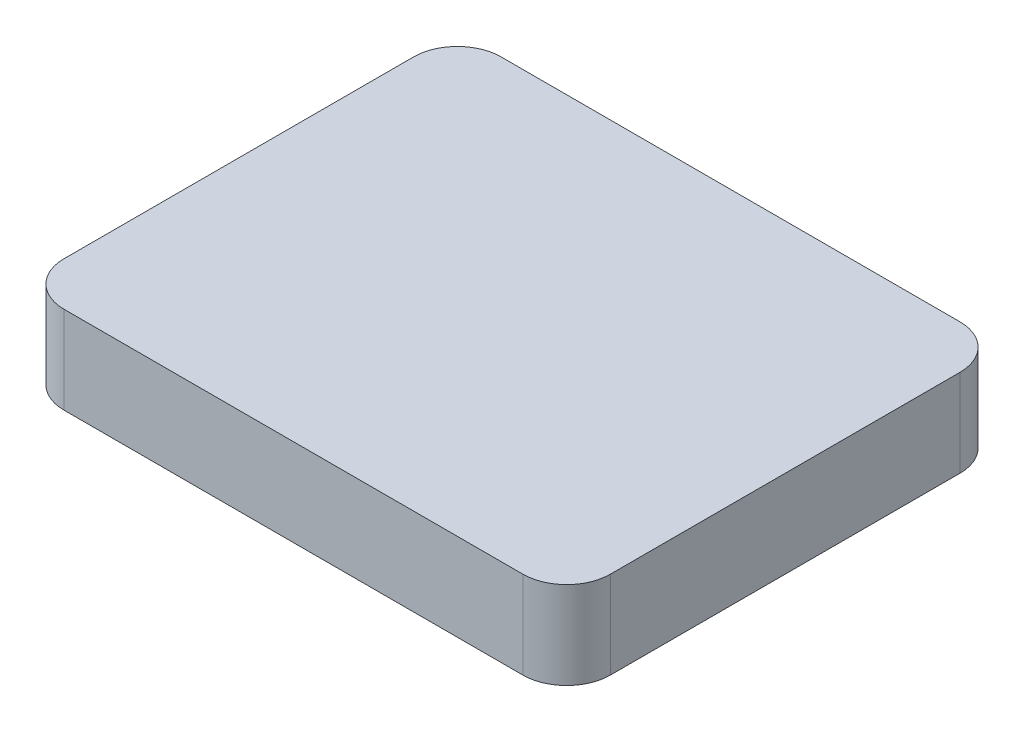
ISO-10303-21;
HEADER;
FILE_DESCRIPTION(('STEP AP214'),'2;1');
FILE_NAME('part.step','',(''),(''),'','','');
FILE_SCHEMA(('AUTOMOTIVE_DESIGN { 1 0 10303 214 1 1 1 1 }'));
ENDSEC;
DATA;
#1=APPLICATION_CONTEXT('core data for automotive mechanical design processes');
#2=APPLICATION_PROTOCOL_DEFINITION('international standard','automotive_design',2000,#1);
#3=PRODUCT_CONTEXT('',#1,'mechanical');
#4=PRODUCT('Part','Part','',(#3));
#5=PRODUCT_RELATED_PRODUCT_CATEGORY('part','',(#4));
#6=PRODUCT_DEFINITION_FORMATION('','',#4);
#7=PRODUCT_DEFINITION_CONTEXT('part definition',#1,'design');
#8=PRODUCT_DEFINITION('design','',#6,#7);
#9=PRODUCT_DEFINITION_SHAPE('','',#8);
#10=(LENGTH_UNIT() NAMED_UNIT(*) SI_UNIT(.MILLI.,.METRE.));
#11=(NAMED_UNIT(*) PLANE_ANGLE_UNIT() SI_UNIT($,.RADIAN.));
#12=(NAMED_UNIT(*) SI_UNIT($,.STERADIAN.) SOLID_ANGLE_UNIT());
#13=UNCERTAINTY_MEASURE_WITH_UNIT(LENGTH_MEASURE(1.E-05),#10,'distance_accuracy_value','');
#14=(GEOMETRIC_REPRESENTATION_CONTEXT(3) GLOBAL_UNCERTAINTY_ASSIGNED_CONTEXT((#13)) GLOBAL_UNIT_ASSIGNED_CONTEXT((#10,
#11,#12)) REPRESENTATION_CONTEXT('',''));
#15=CARTESIAN_POINT('',(0.,0.,0.));
#16=DIRECTION('',(0.,0.,1.));
#17=DIRECTION('',(1.,0.,0.));
#18=AXIS2_PLACEMENT_3D('',#15,#16,#17);
#19=CARTESIAN_POINT('',(-105.,40.,-80.));
#20=DIRECTION('',(0.,-1.,0.));
#21=DIRECTION('',(0.,0.,-1.));
#22=AXIS2_PLACEMENT_3D('',#19,#20,#21);
#23=CYLINDRICAL_SURFACE('',#22,20.);
#24=CARTESIAN_POINT('',(-105.,0.,-80.));
#25=DIRECTION('',(0.,1.,0.));
#26=DIRECTION('',(0.,0.,1.));
#27=AXIS2_PLACEMENT_3D('',#24,#25,#26);
#28=CIRCLE('',#27,20.);
#29=CARTESIAN_POINT('',(-105.,0.,-100.));
#30=VERTEX_POINT('',#29);
#31=CARTESIAN_POINT('',(-125.,0.,-79.9999999999999));
#32=VERTEX_POINT('',#31);
#33=EDGE_CURVE('E136',#30,#32,#28,.T.);
#34=ORIENTED_EDGE('',*,*,#33,.T.);
#35=DIRECTION('',(0.,-1.,0.));
#36=VECTOR('',#35,1.);
#37=CARTESIAN_POINT('',(-125.,40.,-79.9999999999999));
#38=LINE('',#37,#36);
#39=CARTESIAN_POINT('',(-125.,40.,-79.9999999999999));
#40=VERTEX_POINT('',#39);
#41=EDGE_CURVE('E11',#40,#32,#38,.T.);
#42=ORIENTED_EDGE('',*,*,#41,.F.);
#43=CARTESIAN_POINT('',(-105.,40.,-80.));
#44=DIRECTION('',(0.,1.,0.));
#45=DIRECTION('',(0.,0.,1.));
#46=AXIS2_PLACEMENT_3D('',#43,#44,#45);
#47=CIRCLE('',#46,20.);
#48=CARTESIAN_POINT('',(-105.,40.,-100.));
#49=VERTEX_POINT('',#48);
#50=EDGE_CURVE('E154',#49,#40,#47,.T.);
#51=ORIENTED_EDGE('',*,*,#50,.F.);
#52=DIRECTION('',(0.,-1.,0.));
#53=VECTOR('',#52,1.);
#54=CARTESIAN_POINT('',(-105.,40.,-100.));
#55=LINE('',#54,#53);
#56=EDGE_CURVE('E54',#49,#30,#55,.T.);
#57=ORIENTED_EDGE('',*,*,#56,.T.);
#58=EDGE_LOOP('',(#34,#42,#51,#57));
#59=FACE_BOUND('',#58,.T.);
#60=ADVANCED_FACE('F38',(#59),#23,.T.);
#61=CARTESIAN_POINT('',(-125.,40.,-79.9999999999999));
#62=DIRECTION('',(1.,0.,0.));
#63=DIRECTION('',(0.,0.,-1.));
#64=AXIS2_PLACEMENT_3D('',#61,#62,#63);
#65=PLANE('',#64);
#66=DIRECTION('',(0.,0.,1.));
#67=VECTOR('',#66,1.);
#68=CARTESIAN_POINT('',(-125.,0.,-79.9999999999999));
#69=LINE('',#68,#67);
#70=CARTESIAN_POINT('',(-125.,0.,79.9999999999998));
#71=VERTEX_POINT('',#70);
#72=EDGE_CURVE('E138',#32,#71,#69,.T.);
#73=ORIENTED_EDGE('',*,*,#72,.T.);
#74=DIRECTION('',(0.,-1.,0.));
#75=VECTOR('',#74,1.);
#76=CARTESIAN_POINT('',(-125.,40.,79.9999999999998));
#77=LINE('',#76,#75);
#78=CARTESIAN_POINT('',(-125.,40.,79.9999999999998));
#79=VERTEX_POINT('',#78);
#80=EDGE_CURVE('E46',#79,#71,#77,.T.);
#81=ORIENTED_EDGE('',*,*,#80,.F.);
#82=DIRECTION('',(0.,0.,1.));
#83=VECTOR('',#82,1.);
#84=CARTESIAN_POINT('',(-125.,40.,-79.9999999999999));
#85=LINE('',#84,#83);
#86=EDGE_CURVE('E93',#40,#79,#85,.T.);
#87=ORIENTED_EDGE('',*,*,#86,.F.);
#88=ORIENTED_EDGE('',*,*,#41,.T.);
#89=EDGE_LOOP('',(#73,#81,#87,#88));
#90=FACE_BOUND('',#89,.T.);
#91=ADVANCED_FACE('F181',(#90),#65,.F.);
#92=CARTESIAN_POINT('',(-105.,40.,80.));
#93=DIRECTION('',(0.,-1.,0.));
#94=DIRECTION('',(0.,0.,-1.));
#95=AXIS2_PLACEMENT_3D('',#92,#93,#94);
#96=CYLINDRICAL_SURFACE('',#95,20.);
#97=CARTESIAN_POINT('',(-105.,0.,80.));
#98=DIRECTION('',(0.,1.,0.));
#99=DIRECTION('',(0.,0.,1.));
#100=AXIS2_PLACEMENT_3D('',#97,#98,#99);
#101=CIRCLE('',#100,20.);
#102=CARTESIAN_POINT('',(-105.,0.,100.));
#103=VERTEX_POINT('',#102);
#104=EDGE_CURVE('E140',#71,#103,#101,.T.);
#105=ORIENTED_EDGE('',*,*,#104,.T.);
#106=DIRECTION('',(0.,-1.,0.));
#107=VECTOR('',#106,1.);
#108=CARTESIAN_POINT('',(-105.,40.,100.));
#109=LINE('',#108,#107);
#110=CARTESIAN_POINT('',(-105.,40.,100.));
#111=VERTEX_POINT('',#110);
#112=EDGE_CURVE('E160',#111,#103,#109,.T.);
#113=ORIENTED_EDGE('',*,*,#112,.F.);
#114=CARTESIAN_POINT('',(-105.,40.,80.));
#115=DIRECTION('',(0.,1.,0.));
#116=DIRECTION('',(0.,0.,1.));
#117=AXIS2_PLACEMENT_3D('',#114,#115,#116);
#118=CIRCLE('',#117,20.);
#119=EDGE_CURVE('E168',#79,#111,#118,.T.);
#120=ORIENTED_EDGE('',*,*,#119,.F.);
#121=ORIENTED_EDGE('',*,*,#80,.T.);
#122=EDGE_LOOP('',(#105,#113,#120,#121));
#123=FACE_BOUND('',#122,.T.);
#124=ADVANCED_FACE('F166',(#123),#96,.T.);
#125=CARTESIAN_POINT('',(-105.,40.,100.));
#126=DIRECTION('',(0.,0.,-1.));
#127=DIRECTION('',(-1.,0.,0.));
#128=AXIS2_PLACEMENT_3D('',#125,#126,#127);
#129=PLANE('',#128);
#130=DIRECTION('',(1.,0.,0.));
#131=VECTOR('',#130,1.);
#132=CARTESIAN_POINT('',(-105.,0.,100.));
#133=LINE('',#132,#131);
#134=CARTESIAN_POINT('',(105.,0.,100.));
#135=VERTEX_POINT('',#134);
#136=EDGE_CURVE('E142',#103,#135,#133,.T.);
#137=ORIENTED_EDGE('',*,*,#136,.T.);
#138=DIRECTION('',(0.,-1.,0.));
#139=VECTOR('',#138,1.);
#140=CARTESIAN_POINT('',(105.,40.,100.));
#141=LINE('',#140,#139);
#142=CARTESIAN_POINT('',(105.,40.,100.));
#143=VERTEX_POINT('',#142);
#144=EDGE_CURVE('E158',#143,#135,#141,.T.);
#145=ORIENTED_EDGE('',*,*,#144,.F.);
#146=DIRECTION('',(1.,0.,0.));
#147=VECTOR('',#146,1.);
#148=CARTESIAN_POINT('',(-105.,40.,100.));
#149=LINE('',#148,#147);
#150=EDGE_CURVE('E131',#111,#143,#149,.T.);
#151=ORIENTED_EDGE('',*,*,#150,.F.);
#152=ORIENTED_EDGE('',*,*,#112,.T.);
#153=EDGE_LOOP('',(#137,#145,#151,#152));
#154=FACE_BOUND('',#153,.T.);
#155=ADVANCED_FACE('F175',(#154),#129,.F.);
#156=CARTESIAN_POINT('',(105.,40.,80.));
#157=DIRECTION('',(0.,-1.,0.));
#158=DIRECTION('',(0.,0.,-1.));
#159=AXIS2_PLACEMENT_3D('',#156,#157,#158);
#160=CYLINDRICAL_SURFACE('',#159,20.);
#161=CARTESIAN_POINT('',(105.,0.,80.));
#162=DIRECTION('',(0.,-1.,0.));
#163=DIRECTION('',(0.,0.,-1.));
#164=AXIS2_PLACEMENT_3D('',#161,#162,#163);
#165=CIRCLE('',#164,20.);
#166=CARTESIAN_POINT('',(125.,0.,79.9999999999999));
#167=VERTEX_POINT('',#166);
#168=EDGE_CURVE('E145',#167,#135,#165,.T.);
#169=ORIENTED_EDGE('',*,*,#168,.F.);
#170=DIRECTION('',(0.,-1.,0.));
#171=VECTOR('',#170,1.);
#172=CARTESIAN_POINT('',(125.,40.,79.9999999999999));
#173=LINE('',#172,#171);
#174=CARTESIAN_POINT('',(125.,40.,79.9999999999999));
#175=VERTEX_POINT('',#174);
#176=EDGE_CURVE('E118',#175,#167,#173,.T.);
#177=ORIENTED_EDGE('',*,*,#176,.F.);
#178=CARTESIAN_POINT('',(105.,40.,80.));
#179=DIRECTION('',(0.,-1.,0.));
#180=DIRECTION('',(0.,0.,-1.));
#181=AXIS2_PLACEMENT_3D('',#178,#179,#180);
#182=CIRCLE('',#181,20.);
#183=EDGE_CURVE('E129',#175,#143,#182,.T.);
#184=ORIENTED_EDGE('',*,*,#183,.T.);
#185=ORIENTED_EDGE('',*,*,#144,.T.);
#186=EDGE_LOOP('',(#169,#177,#184,#185));
#187=FACE_BOUND('',#186,.T.);
#188=ADVANCED_FACE('F191',(#187),#160,.T.);
#189=CARTESIAN_POINT('',(125.,40.,-79.9999999999999));
#190=DIRECTION('',(1.,0.,0.));
#191=DIRECTION('',(0.,0.,-1.));
#192=AXIS2_PLACEMENT_3D('',#189,#190,#191);
#193=PLANE('',#192);
#194=DIRECTION('',(0.,0.,1.));
#195=VECTOR('',#194,1.);
#196=CARTESIAN_POINT('',(125.,0.,-79.9999999999999));
#197=LINE('',#196,#195);
#198=CARTESIAN_POINT('',(125.,0.,-79.9999999999999));
#199=VERTEX_POINT('',#198);
#200=EDGE_CURVE('E115',#199,#167,#197,.T.);
#201=ORIENTED_EDGE('',*,*,#200,.F.);
#202=DIRECTION('',(0.,-1.,0.));
#203=VECTOR('',#202,1.);
#204=CARTESIAN_POINT('',(125.,40.,-79.9999999999999));
#205=LINE('',#204,#203);
#206=CARTESIAN_POINT('',(125.,40.,-79.9999999999999));
#207=VERTEX_POINT('',#206);
#208=EDGE_CURVE('E109',#207,#199,#205,.T.);
#209=ORIENTED_EDGE('',*,*,#208,.F.);
#210=DIRECTION('',(0.,0.,1.));
#211=VECTOR('',#210,1.);
#212=CARTESIAN_POINT('',(125.,40.,-79.9999999999999));
#213=LINE('',#212,#211);
#214=EDGE_CURVE('E113',#207,#175,#213,.T.);
#215=ORIENTED_EDGE('',*,*,#214,.T.);
#216=ORIENTED_EDGE('',*,*,#176,.T.);
#217=EDGE_LOOP('',(#201,#209,#215,#216));
#218=FACE_BOUND('',#217,.T.);
#219=ADVANCED_FACE('F111',(#218),#193,.T.);
#220=CARTESIAN_POINT('',(105.,40.,-80.));
#221=DIRECTION('',(0.,-1.,0.));
#222=DIRECTION('',(0.,0.,-1.));
#223=AXIS2_PLACEMENT_3D('',#220,#221,#222);
#224=CYLINDRICAL_SURFACE('',#223,20.);
#225=CARTESIAN_POINT('',(105.,0.,-80.));
#226=DIRECTION('',(0.,1.,0.));
#227=DIRECTION('',(0.,0.,1.));
#228=AXIS2_PLACEMENT_3D('',#225,#226,#227);
#229=CIRCLE('',#228,20.);
#230=CARTESIAN_POINT('',(105.,0.,-100.));
#231=VERTEX_POINT('',#230);
#232=EDGE_CURVE('E149',#199,#231,#229,.T.);
#233=ORIENTED_EDGE('',*,*,#232,.T.);
#234=DIRECTION('',(0.,-1.,0.));
#235=VECTOR('',#234,1.);
#236=CARTESIAN_POINT('',(105.,40.,-100.));
#237=LINE('',#236,#235);
#238=CARTESIAN_POINT('',(105.,40.,-100.));
#239=VERTEX_POINT('',#238);
#240=EDGE_CURVE('E81',#239,#231,#237,.T.);
#241=ORIENTED_EDGE('',*,*,#240,.F.);
#242=CARTESIAN_POINT('',(105.,40.,-80.));
#243=DIRECTION('',(0.,1.,0.));
#244=DIRECTION('',(0.,0.,1.));
#245=AXIS2_PLACEMENT_3D('',#242,#243,#244);
#246=CIRCLE('',#245,20.);
#247=EDGE_CURVE('E120',#207,#239,#246,.T.);
#248=ORIENTED_EDGE('',*,*,#247,.F.);
#249=ORIENTED_EDGE('',*,*,#208,.T.);
#250=EDGE_LOOP('',(#233,#241,#248,#249));
#251=FACE_BOUND('',#250,.T.);
#252=ADVANCED_FACE('F121',(#251),#224,.T.);
#253=CARTESIAN_POINT('',(-105.,40.,-100.));
#254=DIRECTION('',(0.,0.,-1.));
#255=DIRECTION('',(-1.,0.,0.));
#256=AXIS2_PLACEMENT_3D('',#253,#254,#255);
#257=PLANE('',#256);
#258=DIRECTION('',(1.,0.,0.));
#259=VECTOR('',#258,1.);
#260=CARTESIAN_POINT('',(-105.,0.,-100.));
#261=LINE('',#260,#259);
#262=EDGE_CURVE('E151',#30,#231,#261,.T.);
#263=ORIENTED_EDGE('',*,*,#262,.F.);
#264=ORIENTED_EDGE('',*,*,#56,.F.);
#265=DIRECTION('',(1.,0.,0.));
#266=VECTOR('',#265,1.);
#267=CARTESIAN_POINT('',(-105.,40.,-100.));
#268=LINE('',#267,#266);
#269=EDGE_CURVE('E124',#49,#239,#268,.T.);
#270=ORIENTED_EDGE('',*,*,#269,.T.);
#271=ORIENTED_EDGE('',*,*,#240,.T.);
#272=EDGE_LOOP('',(#263,#264,#270,#271));
#273=FACE_BOUND('',#272,.T.);
#274=ADVANCED_FACE('F199',(#273),#257,.T.);
#275=CARTESIAN_POINT('',(-105.,40.,-80.));
#276=DIRECTION('',(0.,1.,0.));
#277=DIRECTION('',(0.,0.,1.));
#278=AXIS2_PLACEMENT_3D('',#275,#276,#277);
#279=PLANE('',#278);
#280=ORIENTED_EDGE('',*,*,#50,.T.);
#281=ORIENTED_EDGE('',*,*,#86,.T.);
#282=ORIENTED_EDGE('',*,*,#119,.T.);
#283=ORIENTED_EDGE('',*,*,#150,.T.);
#284=ORIENTED_EDGE('',*,*,#183,.F.);
#285=ORIENTED_EDGE('',*,*,#214,.F.);
#286=ORIENTED_EDGE('',*,*,#247,.T.);
#287=ORIENTED_EDGE('',*,*,#269,.F.);
#288=EDGE_LOOP('',(#280,#281,#282,#283,#284,#285,#286,#287));
#289=FACE_BOUND('',#288,.T.);
#290=ADVANCED_FACE('F127',(#289),#279,.T.);
#291=CARTESIAN_POINT('',(-105.,0.,-80.));
#292=DIRECTION('',(0.,1.,0.));
#293=DIRECTION('',(0.,0.,1.));
#294=AXIS2_PLACEMENT_3D('',#291,#292,#293);
#295=PLANE('',#294);
#296=ORIENTED_EDGE('',*,*,#33,.F.);
#297=ORIENTED_EDGE('',*,*,#262,.T.);
#298=ORIENTED_EDGE('',*,*,#232,.F.);
#299=ORIENTED_EDGE('',*,*,#200,.T.);
#300=ORIENTED_EDGE('',*,*,#168,.T.);
#301=ORIENTED_EDGE('',*,*,#136,.F.);
#302=ORIENTED_EDGE('',*,*,#104,.F.);
#303=ORIENTED_EDGE('',*,*,#72,.F.);
#304=EDGE_LOOP('',(#296,#297,#298,#299,#300,#301,#302,#303));
#305=FACE_BOUND('',#304,.T.);
#306=ADVANCED_FACE('F171',(#305),#295,.F.);
#307=CLOSED_SHELL('',(#60,#91,#124,#155,#188,#219,#252,#274,#290,#306));
#308=MANIFOLD_SOLID_BREP('B2',#307);
#309=ADVANCED_BREP_SHAPE_REPRESENTATION('',(#18,#308),#14);
#310=SHAPE_DEFINITION_REPRESENTATION(#9,#309);
ENDSEC;
END-ISO-10303-21;
